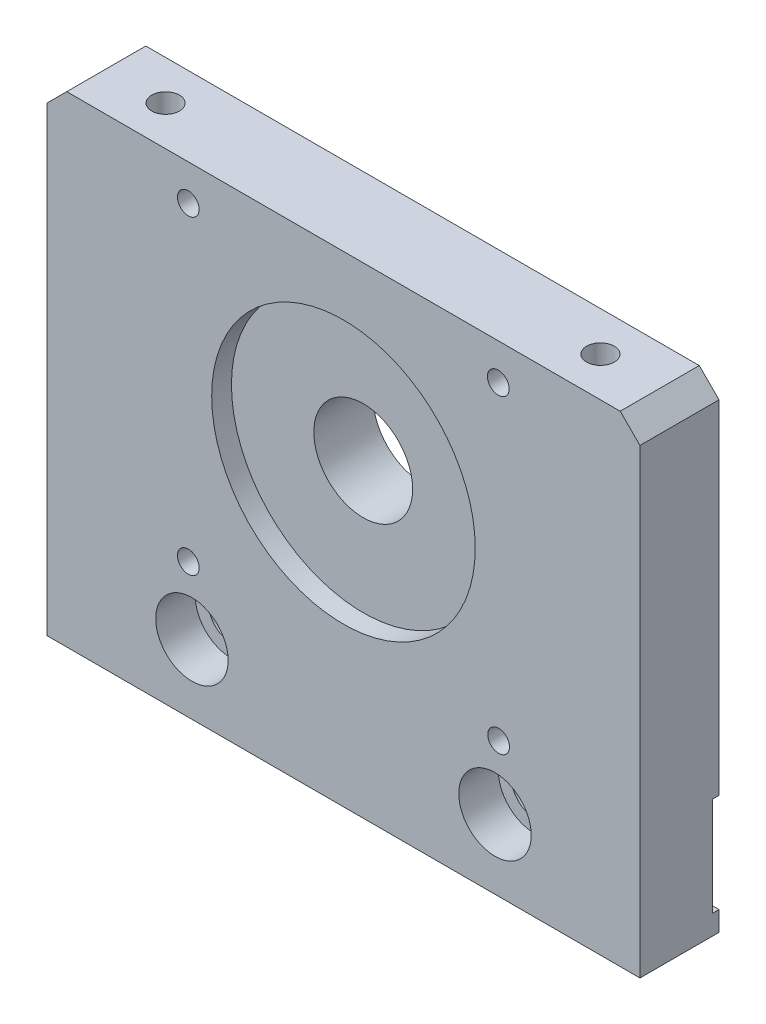
ISO-10303-21;
HEADER;
FILE_DESCRIPTION(('STEP AP214'),'2;1');
FILE_NAME('part.step','',(''),(''),'','','');
FILE_SCHEMA(('AUTOMOTIVE_DESIGN { 1 0 10303 214 1 1 1 1 }'));
ENDSEC;
DATA;
#1=APPLICATION_CONTEXT('core data for automotive mechanical design processes');
#2=APPLICATION_PROTOCOL_DEFINITION('international standard','automotive_design',2000,#1);
#3=PRODUCT_CONTEXT('',#1,'mechanical');
#4=PRODUCT('Part','Part','',(#3));
#5=PRODUCT_RELATED_PRODUCT_CATEGORY('part','',(#4));
#6=PRODUCT_DEFINITION_FORMATION('','',#4);
#7=PRODUCT_DEFINITION_CONTEXT('part definition',#1,'design');
#8=PRODUCT_DEFINITION('design','',#6,#7);
#9=PRODUCT_DEFINITION_SHAPE('','',#8);
#10=(LENGTH_UNIT() NAMED_UNIT(*) SI_UNIT(.MILLI.,.METRE.));
#11=(NAMED_UNIT(*) PLANE_ANGLE_UNIT() SI_UNIT($,.RADIAN.));
#12=(NAMED_UNIT(*) SI_UNIT($,.STERADIAN.) SOLID_ANGLE_UNIT());
#13=UNCERTAINTY_MEASURE_WITH_UNIT(LENGTH_MEASURE(1.E-05),#10,'distance_accuracy_value','');
#14=(GEOMETRIC_REPRESENTATION_CONTEXT(3) GLOBAL_UNCERTAINTY_ASSIGNED_CONTEXT((#13)) GLOBAL_UNIT_ASSIGNED_CONTEXT((#10,
#11,#12)) REPRESENTATION_CONTEXT('',''));
#15=CARTESIAN_POINT('',(0.,0.,0.));
#16=DIRECTION('',(0.,0.,1.));
#17=DIRECTION('',(1.,0.,0.));
#18=AXIS2_PLACEMENT_3D('',#15,#16,#17);
#19=CARTESIAN_POINT('',(0.,73.,0.));
#20=DIRECTION('',(0.,0.,-1.));
#21=DIRECTION('',(-1.,0.,0.));
#22=AXIS2_PLACEMENT_3D('',#19,#20,#21);
#23=PLANE('',#22);
#24=DIRECTION('',(1.,0.,0.));
#25=VECTOR('',#24,1.);
#26=CARTESIAN_POINT('',(0.,3.,0.));
#27=LINE('',#26,#25);
#28=CARTESIAN_POINT('',(0.,3.,0.));
#29=VERTEX_POINT('',#28);
#30=CARTESIAN_POINT('',(90.,3.,0.));
#31=VERTEX_POINT('',#30);
#32=EDGE_CURVE('E219',#29,#31,#27,.T.);
#33=ORIENTED_EDGE('',*,*,#32,.T.);
#34=DIRECTION('',(0.,1.,0.));
#35=VECTOR('',#34,1.);
#36=CARTESIAN_POINT('',(90.,0.,0.));
#37=LINE('',#36,#35);
#38=CARTESIAN_POINT('',(90.,0.,0.));
#39=VERTEX_POINT('',#38);
#40=EDGE_CURVE('E257',#39,#31,#37,.T.);
#41=ORIENTED_EDGE('',*,*,#40,.F.);
#42=DIRECTION('',(1.,0.,0.));
#43=VECTOR('',#42,1.);
#44=CARTESIAN_POINT('',(0.,0.,0.));
#45=LINE('',#44,#43);
#46=CARTESIAN_POINT('',(0.,0.,0.));
#47=VERTEX_POINT('',#46);
#48=EDGE_CURVE('E254',#47,#39,#45,.T.);
#49=ORIENTED_EDGE('',*,*,#48,.F.);
#50=DIRECTION('',(0.,-1.,0.));
#51=VECTOR('',#50,1.);
#52=CARTESIAN_POINT('',(0.,0.,0.));
#53=LINE('',#52,#51);
#54=EDGE_CURVE('E237',#29,#47,#53,.T.);
#55=ORIENTED_EDGE('',*,*,#54,.F.);
#56=EDGE_LOOP('',(#33,#41,#49,#55));
#57=FACE_BOUND('',#56,.T.);
#58=ADVANCED_FACE('F36',(#57),#23,.T.);
#59=CARTESIAN_POINT('',(0.,0.,12.));
#60=DIRECTION('',(1.,0.,0.));
#61=DIRECTION('',(0.,0.,-1.));
#62=AXIS2_PLACEMENT_3D('',#59,#60,#61);
#63=PLANE('',#62);
#64=CARTESIAN_POINT('',(0.,43.,5.99999999999984));
#65=DIRECTION('',(-1.,0.,0.));
#66=DIRECTION('',(0.,0.,1.));
#67=AXIS2_PLACEMENT_3D('',#64,#65,#66);
#68=CIRCLE('',#67,2.1);
#69=CARTESIAN_POINT('',(0.,43.,8.09999999999984));
#70=VERTEX_POINT('',#69);
#71=EDGE_CURVE('E144',#70,#70,#68,.T.);
#72=ORIENTED_EDGE('',*,*,#71,.F.);
#73=EDGE_LOOP('',(#72));
#74=FACE_BOUND('',#73,.T.);
#75=DIRECTION('',(0.,-1.,0.));
#76=VECTOR('',#75,1.);
#77=CARTESIAN_POINT('',(0.,3.,1.));
#78=LINE('',#77,#76);
#79=CARTESIAN_POINT('',(0.,18.,1.));
#80=VERTEX_POINT('',#79);
#81=CARTESIAN_POINT('',(0.,3.,1.));
#82=VERTEX_POINT('',#81);
#83=EDGE_CURVE('E204',#80,#82,#78,.T.);
#84=ORIENTED_EDGE('',*,*,#83,.T.);
#85=DIRECTION('',(0.,0.,-1.));
#86=VECTOR('',#85,1.);
#87=CARTESIAN_POINT('',(0.,3.,0.));
#88=LINE('',#87,#86);
#89=EDGE_CURVE('E208',#82,#29,#88,.T.);
#90=ORIENTED_EDGE('',*,*,#89,.T.);
#91=ORIENTED_EDGE('',*,*,#54,.T.);
#92=DIRECTION('',(0.,0.,-1.));
#93=VECTOR('',#92,1.);
#94=CARTESIAN_POINT('',(0.,0.,12.));
#95=LINE('',#94,#93);
#96=CARTESIAN_POINT('',(0.,0.,12.));
#97=VERTEX_POINT('',#96);
#98=EDGE_CURVE('E264',#97,#47,#95,.T.);
#99=ORIENTED_EDGE('',*,*,#98,.F.);
#100=DIRECTION('',(0.,-1.,0.));
#101=VECTOR('',#100,1.);
#102=CARTESIAN_POINT('',(0.,0.,12.));
#103=LINE('',#102,#101);
#104=CARTESIAN_POINT('',(0.,70.,12.));
#105=VERTEX_POINT('',#104);
#106=EDGE_CURVE('E240',#105,#97,#103,.T.);
#107=ORIENTED_EDGE('',*,*,#106,.F.);
#108=DIRECTION('',(0.,0.,-1.));
#109=VECTOR('',#108,1.);
#110=CARTESIAN_POINT('',(0.,70.,12.));
#111=LINE('',#110,#109);
#112=CARTESIAN_POINT('',(0.,70.,0.));
#113=VERTEX_POINT('',#112);
#114=EDGE_CURVE('E267',#105,#113,#111,.T.);
#115=ORIENTED_EDGE('',*,*,#114,.T.);
#116=CARTESIAN_POINT('',(0.,18.,0.));
#117=VERTEX_POINT('',#116);
#118=EDGE_CURVE('E251',#113,#117,#53,.T.);
#119=ORIENTED_EDGE('',*,*,#118,.T.);
#120=DIRECTION('',(0.,0.,1.));
#121=VECTOR('',#120,1.);
#122=CARTESIAN_POINT('',(0.,18.,0.));
#123=LINE('',#122,#121);
#124=EDGE_CURVE('E53',#117,#80,#123,.T.);
#125=ORIENTED_EDGE('',*,*,#124,.T.);
#126=EDGE_LOOP('',(#84,#90,#91,#99,#107,#115,#119,#125));
#127=FACE_BOUND('',#126,.T.);
#128=ADVANCED_FACE('F304',(#74,#127),#63,.F.);
#129=CARTESIAN_POINT('',(0.,0.,12.));
#130=DIRECTION('',(0.,1.,0.));
#131=DIRECTION('',(0.,0.,1.));
#132=AXIS2_PLACEMENT_3D('',#129,#130,#131);
#133=PLANE('',#132);
#134=ORIENTED_EDGE('',*,*,#48,.T.);
#135=DIRECTION('',(0.,0.,-1.));
#136=VECTOR('',#135,1.);
#137=CARTESIAN_POINT('',(90.,0.,12.));
#138=LINE('',#137,#136);
#139=CARTESIAN_POINT('',(90.,0.,12.));
#140=VERTEX_POINT('',#139);
#141=EDGE_CURVE('E250',#140,#39,#138,.T.);
#142=ORIENTED_EDGE('',*,*,#141,.F.);
#143=DIRECTION('',(1.,0.,0.));
#144=VECTOR('',#143,1.);
#145=CARTESIAN_POINT('',(0.,0.,12.));
#146=LINE('',#145,#144);
#147=EDGE_CURVE('E242',#97,#140,#146,.T.);
#148=ORIENTED_EDGE('',*,*,#147,.F.);
#149=ORIENTED_EDGE('',*,*,#98,.T.);
#150=EDGE_LOOP('',(#134,#142,#148,#149));
#151=FACE_BOUND('',#150,.T.);
#152=ADVANCED_FACE('F312',(#151),#133,.F.);
#153=CARTESIAN_POINT('',(90.,0.,12.));
#154=DIRECTION('',(-1.,0.,0.));
#155=DIRECTION('',(0.,0.,1.));
#156=AXIS2_PLACEMENT_3D('',#153,#154,#155);
#157=PLANE('',#156);
#158=ORIENTED_EDGE('',*,*,#40,.T.);
#159=DIRECTION('',(0.,0.,-1.));
#160=VECTOR('',#159,1.);
#161=CARTESIAN_POINT('',(90.,3.,0.));
#162=LINE('',#161,#160);
#163=CARTESIAN_POINT('',(90.,3.,1.));
#164=VERTEX_POINT('',#163);
#165=EDGE_CURVE('E205',#164,#31,#162,.T.);
#166=ORIENTED_EDGE('',*,*,#165,.F.);
#167=DIRECTION('',(0.,-1.,0.));
#168=VECTOR('',#167,1.);
#169=CARTESIAN_POINT('',(90.,3.,1.));
#170=LINE('',#169,#168);
#171=CARTESIAN_POINT('',(90.,18.,1.));
#172=VERTEX_POINT('',#171);
#173=EDGE_CURVE('E215',#172,#164,#170,.T.);
#174=ORIENTED_EDGE('',*,*,#173,.F.);
#175=DIRECTION('',(0.,0.,1.));
#176=VECTOR('',#175,1.);
#177=CARTESIAN_POINT('',(90.,18.,0.));
#178=LINE('',#177,#176);
#179=CARTESIAN_POINT('',(90.,18.,0.));
#180=VERTEX_POINT('',#179);
#181=EDGE_CURVE('E212',#180,#172,#178,.T.);
#182=ORIENTED_EDGE('',*,*,#181,.F.);
#183=CARTESIAN_POINT('',(90.,70.,0.));
#184=VERTEX_POINT('',#183);
#185=EDGE_CURVE('E256',#180,#184,#37,.T.);
#186=ORIENTED_EDGE('',*,*,#185,.T.);
#187=DIRECTION('',(0.,0.,1.));
#188=VECTOR('',#187,1.);
#189=CARTESIAN_POINT('',(90.,70.,12.));
#190=LINE('',#189,#188);
#191=CARTESIAN_POINT('',(90.,70.,12.));
#192=VERTEX_POINT('',#191);
#193=EDGE_CURVE('E11',#184,#192,#190,.T.);
#194=ORIENTED_EDGE('',*,*,#193,.T.);
#195=DIRECTION('',(0.,1.,0.));
#196=VECTOR('',#195,1.);
#197=CARTESIAN_POINT('',(90.,0.,12.));
#198=LINE('',#197,#196);
#199=EDGE_CURVE('E245',#140,#192,#198,.T.);
#200=ORIENTED_EDGE('',*,*,#199,.F.);
#201=ORIENTED_EDGE('',*,*,#141,.T.);
#202=EDGE_LOOP('',(#158,#166,#174,#182,#186,#194,#200,#201));
#203=FACE_BOUND('',#202,.T.);
#204=ADVANCED_FACE('F365',(#203),#157,.F.);
#205=CARTESIAN_POINT('',(0.,73.,12.));
#206=DIRECTION('',(0.,-1.,0.));
#207=DIRECTION('',(0.,0.,-1.));
#208=AXIS2_PLACEMENT_3D('',#205,#206,#207);
#209=PLANE('',#208);
#210=CARTESIAN_POINT('',(11.9999999999999,73.,6.00000000000001));
#211=DIRECTION('',(0.,1.,0.));
#212=DIRECTION('',(0.,0.,1.));
#213=AXIS2_PLACEMENT_3D('',#210,#211,#212);
#214=CIRCLE('',#213,2.09999999999999);
#215=CARTESIAN_POINT('',(11.9999999999999,73.,8.1));
#216=VERTEX_POINT('',#215);
#217=EDGE_CURVE('E172',#216,#216,#214,.T.);
#218=ORIENTED_EDGE('',*,*,#217,.F.);
#219=EDGE_LOOP('',(#218));
#220=FACE_BOUND('',#219,.T.);
#221=CARTESIAN_POINT('',(78.0000000000001,73.,6.00000000000001));
#222=DIRECTION('',(0.,1.,0.));
#223=DIRECTION('',(0.,0.,1.));
#224=AXIS2_PLACEMENT_3D('',#221,#222,#223);
#225=CIRCLE('',#224,2.09999999999999);
#226=CARTESIAN_POINT('',(78.0000000000001,73.,8.1));
#227=VERTEX_POINT('',#226);
#228=EDGE_CURVE('E178',#227,#227,#225,.T.);
#229=ORIENTED_EDGE('',*,*,#228,.F.);
#230=EDGE_LOOP('',(#229));
#231=FACE_BOUND('',#230,.T.);
#232=DIRECTION('',(-1.,0.,0.));
#233=VECTOR('',#232,1.);
#234=CARTESIAN_POINT('',(0.,73.,0.));
#235=LINE('',#234,#233);
#236=CARTESIAN_POINT('',(87.,73.,0.));
#237=VERTEX_POINT('',#236);
#238=CARTESIAN_POINT('',(3.00000000000003,73.,0.));
#239=VERTEX_POINT('',#238);
#240=EDGE_CURVE('E243',#237,#239,#235,.T.);
#241=ORIENTED_EDGE('',*,*,#240,.T.);
#242=DIRECTION('',(0.,0.,1.));
#243=VECTOR('',#242,1.);
#244=CARTESIAN_POINT('',(3.00000000000003,73.,12.));
#245=LINE('',#244,#243);
#246=CARTESIAN_POINT('',(3.00000000000003,73.,12.));
#247=VERTEX_POINT('',#246);
#248=EDGE_CURVE('E278',#239,#247,#245,.T.);
#249=ORIENTED_EDGE('',*,*,#248,.T.);
#250=DIRECTION('',(-1.,0.,0.));
#251=VECTOR('',#250,1.);
#252=CARTESIAN_POINT('',(0.,73.,12.));
#253=LINE('',#252,#251);
#254=CARTESIAN_POINT('',(87.,73.,12.));
#255=VERTEX_POINT('',#254);
#256=EDGE_CURVE('E247',#255,#247,#253,.T.);
#257=ORIENTED_EDGE('',*,*,#256,.F.);
#258=DIRECTION('',(0.,0.,-1.));
#259=VECTOR('',#258,1.);
#260=CARTESIAN_POINT('',(87.,73.,12.));
#261=LINE('',#260,#259);
#262=EDGE_CURVE('E275',#255,#237,#261,.T.);
#263=ORIENTED_EDGE('',*,*,#262,.T.);
#264=EDGE_LOOP('',(#241,#249,#257,#263));
#265=FACE_BOUND('',#264,.T.);
#266=ADVANCED_FACE('F329',(#220,#231,#265),#209,.F.);
#267=CARTESIAN_POINT('',(0.,73.,12.));
#268=DIRECTION('',(0.,0.,-1.));
#269=DIRECTION('',(-1.,0.,0.));
#270=AXIS2_PLACEMENT_3D('',#267,#268,#269);
#271=PLANE('',#270);
#272=CARTESIAN_POINT('',(68.4999999999999,67.5000000000001,12.));
#273=DIRECTION('',(0.,0.,1.));
#274=DIRECTION('',(1.,0.,0.));
#275=AXIS2_PLACEMENT_3D('',#272,#273,#274);
#276=CIRCLE('',#275,1.65);
#277=CARTESIAN_POINT('',(70.1499999999999,67.5000000000001,12.));
#278=VERTEX_POINT('',#277);
#279=EDGE_CURVE('E143',#278,#278,#276,.T.);
#280=ORIENTED_EDGE('',*,*,#279,.F.);
#281=EDGE_LOOP('',(#280));
#282=FACE_BOUND('',#281,.T.);
#283=CARTESIAN_POINT('',(21.4499999999999,67.5500000000001,12.));
#284=DIRECTION('',(0.,0.,1.));
#285=DIRECTION('',(1.,0.,0.));
#286=AXIS2_PLACEMENT_3D('',#283,#284,#285);
#287=CIRCLE('',#286,1.65);
#288=CARTESIAN_POINT('',(23.0999999999999,67.5500000000001,12.));
#289=VERTEX_POINT('',#288);
#290=EDGE_CURVE('E154',#289,#289,#287,.T.);
#291=ORIENTED_EDGE('',*,*,#290,.F.);
#292=EDGE_LOOP('',(#291));
#293=FACE_BOUND('',#292,.T.);
#294=CARTESIAN_POINT('',(21.4499999999999,20.4500000000001,12.));
#295=DIRECTION('',(0.,0.,1.));
#296=DIRECTION('',(1.,0.,0.));
#297=AXIS2_PLACEMENT_3D('',#294,#295,#296);
#298=CIRCLE('',#297,1.65);
#299=CARTESIAN_POINT('',(23.0999999999999,20.4500000000001,12.));
#300=VERTEX_POINT('',#299);
#301=EDGE_CURVE('E160',#300,#300,#298,.T.);
#302=ORIENTED_EDGE('',*,*,#301,.F.);
#303=EDGE_LOOP('',(#302));
#304=FACE_BOUND('',#303,.T.);
#305=CARTESIAN_POINT('',(68.5499999999999,20.4500000000001,12.));
#306=DIRECTION('',(0.,0.,1.));
#307=DIRECTION('',(1.,0.,0.));
#308=AXIS2_PLACEMENT_3D('',#305,#306,#307);
#309=CIRCLE('',#308,1.65);
#310=CARTESIAN_POINT('',(70.1999999999999,20.4500000000001,12.));
#311=VERTEX_POINT('',#310);
#312=EDGE_CURVE('E166',#311,#311,#309,.T.);
#313=ORIENTED_EDGE('',*,*,#312,.F.);
#314=EDGE_LOOP('',(#313));
#315=FACE_BOUND('',#314,.T.);
#316=CARTESIAN_POINT('',(22.,10.5,12.));
#317=DIRECTION('',(0.,0.,1.));
#318=DIRECTION('',(1.,0.,0.));
#319=AXIS2_PLACEMENT_3D('',#316,#317,#318);
#320=CIRCLE('',#319,5.49999999999999);
#321=CARTESIAN_POINT('',(27.5,10.5,12.));
#322=VERTEX_POINT('',#321);
#323=EDGE_CURVE('E184',#322,#322,#320,.T.);
#324=ORIENTED_EDGE('',*,*,#323,.F.);
#325=EDGE_LOOP('',(#324));
#326=FACE_BOUND('',#325,.T.);
#327=CARTESIAN_POINT('',(68.,10.5,12.));
#328=DIRECTION('',(0.,0.,1.));
#329=DIRECTION('',(1.,0.,0.));
#330=AXIS2_PLACEMENT_3D('',#327,#328,#329);
#331=CIRCLE('',#330,5.49999999999999);
#332=CARTESIAN_POINT('',(73.5,10.5,12.));
#333=VERTEX_POINT('',#332);
#334=EDGE_CURVE('E193',#333,#333,#331,.T.);
#335=ORIENTED_EDGE('',*,*,#334,.F.);
#336=EDGE_LOOP('',(#335));
#337=FACE_BOUND('',#336,.T.);
#338=CARTESIAN_POINT('',(45.,44.,12.));
#339=DIRECTION('',(0.,0.,1.));
#340=DIRECTION('',(1.,0.,0.));
#341=AXIS2_PLACEMENT_3D('',#338,#339,#340);
#342=CIRCLE('',#341,20.);
#343=CARTESIAN_POINT('',(65.,44.,12.));
#344=VERTEX_POINT('',#343);
#345=EDGE_CURVE('E231',#344,#344,#342,.T.);
#346=ORIENTED_EDGE('',*,*,#345,.F.);
#347=EDGE_LOOP('',(#346));
#348=FACE_BOUND('',#347,.T.);
#349=ORIENTED_EDGE('',*,*,#256,.T.);
#350=DIRECTION('',(0.707106781186549,0.707106781186546,0.));
#351=VECTOR('',#350,1.);
#352=CARTESIAN_POINT('',(0.,70.,12.));
#353=LINE('',#352,#351);
#354=EDGE_CURVE('E45',#247,#105,#353,.F.);
#355=ORIENTED_EDGE('',*,*,#354,.T.);
#356=ORIENTED_EDGE('',*,*,#106,.T.);
#357=ORIENTED_EDGE('',*,*,#147,.T.);
#358=ORIENTED_EDGE('',*,*,#199,.T.);
#359=DIRECTION('',(0.707106781186544,-0.707106781186551,0.));
#360=VECTOR('',#359,1.);
#361=CARTESIAN_POINT('',(87.,73.,12.));
#362=LINE('',#361,#360);
#363=EDGE_CURVE('E280',#192,#255,#362,.F.);
#364=ORIENTED_EDGE('',*,*,#363,.T.);
#365=EDGE_LOOP('',(#349,#355,#356,#357,#358,#364));
#366=FACE_BOUND('',#365,.T.);
#367=ADVANCED_FACE('F319',(#282,#293,#304,#315,#326,#337,#348,#366),#271,.F.);
#368=DIRECTION('',(1.,0.,0.));
#369=VECTOR('',#368,1.);
#370=CARTESIAN_POINT('',(0.,18.,0.));
#371=LINE('',#370,#369);
#372=EDGE_CURVE('E211',#117,#180,#371,.T.);
#373=ORIENTED_EDGE('',*,*,#372,.F.);
#374=ORIENTED_EDGE('',*,*,#118,.F.);
#375=DIRECTION('',(-0.707106781186549,-0.707106781186546,0.));
#376=VECTOR('',#375,1.);
#377=CARTESIAN_POINT('',(1.50000000000001,71.5,0.));
#378=LINE('',#377,#376);
#379=EDGE_CURVE('E273',#113,#239,#378,.F.);
#380=ORIENTED_EDGE('',*,*,#379,.T.);
#381=ORIENTED_EDGE('',*,*,#240,.F.);
#382=DIRECTION('',(-0.707106781186544,0.707106781186551,0.));
#383=VECTOR('',#382,1.);
#384=CARTESIAN_POINT('',(43.5000000000004,116.5,0.));
#385=LINE('',#384,#383);
#386=EDGE_CURVE('E270',#237,#184,#385,.F.);
#387=ORIENTED_EDGE('',*,*,#386,.T.);
#388=ORIENTED_EDGE('',*,*,#185,.F.);
#389=EDGE_LOOP('',(#373,#374,#380,#381,#387,#388));
#390=FACE_BOUND('',#389,.T.);
#391=CARTESIAN_POINT('',(45.,44.,0.));
#392=DIRECTION('',(0.,0.,1.));
#393=DIRECTION('',(1.,0.,0.));
#394=AXIS2_PLACEMENT_3D('',#391,#392,#393);
#395=CIRCLE('',#394,7.5);
#396=CARTESIAN_POINT('',(52.5,44.,0.));
#397=VERTEX_POINT('',#396);
#398=EDGE_CURVE('E228',#397,#397,#395,.T.);
#399=ORIENTED_EDGE('',*,*,#398,.T.);
#400=EDGE_LOOP('',(#399));
#401=FACE_BOUND('',#400,.T.);
#402=ADVANCED_FACE('F307',(#390,#401),#23,.T.);
#403=CARTESIAN_POINT('',(45.,44.,9.));
#404=DIRECTION('',(0.,0.,1.));
#405=DIRECTION('',(1.,0.,0.));
#406=AXIS2_PLACEMENT_3D('',#403,#404,#405);
#407=CYLINDRICAL_SURFACE('',#406,20.);
#408=CARTESIAN_POINT('',(45.,44.,9.));
#409=DIRECTION('',(0.,0.,1.));
#410=DIRECTION('',(1.,0.,0.));
#411=AXIS2_PLACEMENT_3D('',#408,#409,#410);
#412=CIRCLE('',#411,20.);
#413=CARTESIAN_POINT('',(65.,44.,9.));
#414=VERTEX_POINT('',#413);
#415=EDGE_CURVE('E234',#414,#414,#412,.T.);
#416=ORIENTED_EDGE('',*,*,#415,.F.);
#417=EDGE_LOOP('',(#416));
#418=FACE_BOUND('',#417,.T.);
#419=ORIENTED_EDGE('',*,*,#345,.T.);
#420=EDGE_LOOP('',(#419));
#421=FACE_BOUND('',#420,.T.);
#422=ADVANCED_FACE('F318',(#418,#421),#407,.F.);
#423=CARTESIAN_POINT('',(45.,44.,9.));
#424=DIRECTION('',(0.,0.,1.));
#425=DIRECTION('',(1.,0.,0.));
#426=AXIS2_PLACEMENT_3D('',#423,#424,#425);
#427=PLANE('',#426);
#428=CARTESIAN_POINT('',(45.,44.,9.));
#429=DIRECTION('',(0.,0.,1.));
#430=DIRECTION('',(1.,0.,0.));
#431=AXIS2_PLACEMENT_3D('',#428,#429,#430);
#432=CIRCLE('',#431,7.5);
#433=CARTESIAN_POINT('',(52.5,44.,9.));
#434=VERTEX_POINT('',#433);
#435=EDGE_CURVE('E222',#434,#434,#432,.T.);
#436=ORIENTED_EDGE('',*,*,#435,.F.);
#437=EDGE_LOOP('',(#436));
#438=FACE_BOUND('',#437,.T.);
#439=ORIENTED_EDGE('',*,*,#415,.T.);
#440=EDGE_LOOP('',(#439));
#441=FACE_BOUND('',#440,.T.);
#442=ADVANCED_FACE('F325',(#438,#441),#427,.T.);
#443=CARTESIAN_POINT('',(45.,44.,0.));
#444=DIRECTION('',(0.,0.,1.));
#445=DIRECTION('',(1.,0.,0.));
#446=AXIS2_PLACEMENT_3D('',#443,#444,#445);
#447=CYLINDRICAL_SURFACE('',#446,7.5);
#448=ORIENTED_EDGE('',*,*,#398,.F.);
#449=EDGE_LOOP('',(#448));
#450=FACE_BOUND('',#449,.T.);
#451=ORIENTED_EDGE('',*,*,#435,.T.);
#452=EDGE_LOOP('',(#451));
#453=FACE_BOUND('',#452,.T.);
#454=ADVANCED_FACE('F336',(#450,#453),#447,.F.);
#455=CARTESIAN_POINT('',(0.,70.,12.));
#456=DIRECTION('',(0.707106781186546,-0.707106781186549,0.));
#457=DIRECTION('',(0.707106781186549,0.707106781186546,0.));
#458=AXIS2_PLACEMENT_3D('',#455,#456,#457);
#459=PLANE('',#458);
#460=ORIENTED_EDGE('',*,*,#354,.F.);
#461=ORIENTED_EDGE('',*,*,#248,.F.);
#462=ORIENTED_EDGE('',*,*,#379,.F.);
#463=ORIENTED_EDGE('',*,*,#114,.F.);
#464=EDGE_LOOP('',(#460,#461,#462,#463));
#465=FACE_BOUND('',#464,.T.);
#466=ADVANCED_FACE('F339',(#465),#459,.F.);
#467=CARTESIAN_POINT('',(87.,73.,12.));
#468=DIRECTION('',(-0.707106781186551,-0.707106781186544,0.));
#469=DIRECTION('',(0.707106781186544,-0.707106781186551,0.));
#470=AXIS2_PLACEMENT_3D('',#467,#468,#469);
#471=PLANE('',#470);
#472=ORIENTED_EDGE('',*,*,#363,.F.);
#473=ORIENTED_EDGE('',*,*,#193,.F.);
#474=ORIENTED_EDGE('',*,*,#386,.F.);
#475=ORIENTED_EDGE('',*,*,#262,.F.);
#476=EDGE_LOOP('',(#472,#473,#474,#475));
#477=FACE_BOUND('',#476,.T.);
#478=ADVANCED_FACE('F38',(#477),#471,.F.);
#479=CARTESIAN_POINT('',(0.,3.,0.));
#480=DIRECTION('',(0.,-1.,0.));
#481=DIRECTION('',(0.,0.,-1.));
#482=AXIS2_PLACEMENT_3D('',#479,#480,#481);
#483=PLANE('',#482);
#484=ORIENTED_EDGE('',*,*,#165,.T.);
#485=ORIENTED_EDGE('',*,*,#32,.F.);
#486=ORIENTED_EDGE('',*,*,#89,.F.);
#487=DIRECTION('',(1.,0.,0.));
#488=VECTOR('',#487,1.);
#489=CARTESIAN_POINT('',(0.,3.,1.));
#490=LINE('',#489,#488);
#491=EDGE_CURVE('E223',#82,#164,#490,.T.);
#492=ORIENTED_EDGE('',*,*,#491,.T.);
#493=EDGE_LOOP('',(#484,#485,#486,#492));
#494=FACE_BOUND('',#493,.T.);
#495=ADVANCED_FACE('F377',(#494),#483,.F.);
#496=CARTESIAN_POINT('',(0.,3.,1.));
#497=DIRECTION('',(0.,0.,1.));
#498=DIRECTION('',(1.,0.,0.));
#499=AXIS2_PLACEMENT_3D('',#496,#497,#498);
#500=PLANE('',#499);
#501=CARTESIAN_POINT('',(22.,10.5,1.));
#502=DIRECTION('',(0.,0.,1.));
#503=DIRECTION('',(1.,0.,0.));
#504=AXIS2_PLACEMENT_3D('',#501,#502,#503);
#505=CIRCLE('',#504,3.5);
#506=CARTESIAN_POINT('',(25.5,10.5,1.));
#507=VERTEX_POINT('',#506);
#508=EDGE_CURVE('E40',#507,#507,#505,.T.);
#509=ORIENTED_EDGE('',*,*,#508,.T.);
#510=EDGE_LOOP('',(#509));
#511=FACE_BOUND('',#510,.T.);
#512=CARTESIAN_POINT('',(68.,10.5,1.));
#513=DIRECTION('',(0.,0.,1.));
#514=DIRECTION('',(1.,0.,0.));
#515=AXIS2_PLACEMENT_3D('',#512,#513,#514);
#516=CIRCLE('',#515,3.5);
#517=CARTESIAN_POINT('',(71.5,10.5,1.));
#518=VERTEX_POINT('',#517);
#519=EDGE_CURVE('E202',#518,#518,#516,.T.);
#520=ORIENTED_EDGE('',*,*,#519,.T.);
#521=EDGE_LOOP('',(#520));
#522=FACE_BOUND('',#521,.T.);
#523=ORIENTED_EDGE('',*,*,#173,.T.);
#524=ORIENTED_EDGE('',*,*,#491,.F.);
#525=ORIENTED_EDGE('',*,*,#83,.F.);
#526=DIRECTION('',(1.,0.,0.));
#527=VECTOR('',#526,1.);
#528=CARTESIAN_POINT('',(0.,18.,1.));
#529=LINE('',#528,#527);
#530=EDGE_CURVE('E225',#80,#172,#529,.T.);
#531=ORIENTED_EDGE('',*,*,#530,.T.);
#532=EDGE_LOOP('',(#523,#524,#525,#531));
#533=FACE_BOUND('',#532,.T.);
#534=ADVANCED_FACE('F285',(#511,#522,#533),#500,.F.);
#535=CARTESIAN_POINT('',(0.,18.,0.));
#536=DIRECTION('',(0.,1.,0.));
#537=DIRECTION('',(0.,0.,1.));
#538=AXIS2_PLACEMENT_3D('',#535,#536,#537);
#539=PLANE('',#538);
#540=ORIENTED_EDGE('',*,*,#181,.T.);
#541=ORIENTED_EDGE('',*,*,#530,.F.);
#542=ORIENTED_EDGE('',*,*,#124,.F.);
#543=ORIENTED_EDGE('',*,*,#372,.T.);
#544=EDGE_LOOP('',(#540,#541,#542,#543));
#545=FACE_BOUND('',#544,.T.);
#546=ADVANCED_FACE('F291',(#545),#539,.F.);
#547=CARTESIAN_POINT('',(68.,10.5,12.));
#548=DIRECTION('',(0.,0.,1.));
#549=DIRECTION('',(1.,0.,0.));
#550=AXIS2_PLACEMENT_3D('',#547,#548,#549);
#551=CYLINDRICAL_SURFACE('',#550,3.5);
#552=CARTESIAN_POINT('',(68.,10.5,6.));
#553=DIRECTION('',(0.,0.,1.));
#554=DIRECTION('',(1.,0.,0.));
#555=AXIS2_PLACEMENT_3D('',#552,#553,#554);
#556=CIRCLE('',#555,3.5);
#557=CARTESIAN_POINT('',(71.5,10.5,6.));
#558=VERTEX_POINT('',#557);
#559=EDGE_CURVE('E199',#558,#558,#556,.T.);
#560=ORIENTED_EDGE('',*,*,#559,.T.);
#561=EDGE_LOOP('',(#560));
#562=FACE_BOUND('',#561,.T.);
#563=ORIENTED_EDGE('',*,*,#519,.F.);
#564=EDGE_LOOP('',(#563));
#565=FACE_BOUND('',#564,.T.);
#566=ADVANCED_FACE('F288',(#562,#565),#551,.F.);
#567=CARTESIAN_POINT('',(71.5,10.5,6.));
#568=DIRECTION('',(0.,0.,-1.));
#569=DIRECTION('',(-1.,0.,0.));
#570=AXIS2_PLACEMENT_3D('',#567,#568,#569);
#571=PLANE('',#570);
#572=ORIENTED_EDGE('',*,*,#559,.F.);
#573=EDGE_LOOP('',(#572));
#574=FACE_BOUND('',#573,.T.);
#575=CARTESIAN_POINT('',(68.,10.5,6.));
#576=DIRECTION('',(0.,0.,1.));
#577=DIRECTION('',(1.,0.,0.));
#578=AXIS2_PLACEMENT_3D('',#575,#576,#577);
#579=CIRCLE('',#578,5.49999999999999);
#580=CARTESIAN_POINT('',(73.5,10.5,6.));
#581=VERTEX_POINT('',#580);
#582=EDGE_CURVE('E196',#581,#581,#579,.T.);
#583=ORIENTED_EDGE('',*,*,#582,.T.);
#584=EDGE_LOOP('',(#583));
#585=FACE_BOUND('',#584,.T.);
#586=ADVANCED_FACE('F290',(#574,#585),#571,.F.);
#587=CARTESIAN_POINT('',(68.,10.5,12.));
#588=DIRECTION('',(0.,0.,1.));
#589=DIRECTION('',(1.,0.,0.));
#590=AXIS2_PLACEMENT_3D('',#587,#588,#589);
#591=CYLINDRICAL_SURFACE('',#590,5.49999999999999);
#592=ORIENTED_EDGE('',*,*,#582,.F.);
#593=EDGE_LOOP('',(#592));
#594=FACE_BOUND('',#593,.T.);
#595=ORIENTED_EDGE('',*,*,#334,.T.);
#596=EDGE_LOOP('',(#595));
#597=FACE_BOUND('',#596,.T.);
#598=ADVANCED_FACE('F298',(#594,#597),#591,.F.);
#599=CARTESIAN_POINT('',(22.,10.5,12.));
#600=DIRECTION('',(0.,0.,1.));
#601=DIRECTION('',(1.,0.,0.));
#602=AXIS2_PLACEMENT_3D('',#599,#600,#601);
#603=CYLINDRICAL_SURFACE('',#602,3.5);
#604=CARTESIAN_POINT('',(22.,10.5,6.));
#605=DIRECTION('',(0.,0.,1.));
#606=DIRECTION('',(1.,0.,0.));
#607=AXIS2_PLACEMENT_3D('',#604,#605,#606);
#608=CIRCLE('',#607,3.5);
#609=CARTESIAN_POINT('',(25.5,10.5,6.));
#610=VERTEX_POINT('',#609);
#611=EDGE_CURVE('E190',#610,#610,#608,.T.);
#612=ORIENTED_EDGE('',*,*,#611,.T.);
#613=EDGE_LOOP('',(#612));
#614=FACE_BOUND('',#613,.T.);
#615=ORIENTED_EDGE('',*,*,#508,.F.);
#616=EDGE_LOOP('',(#615));
#617=FACE_BOUND('',#616,.T.);
#618=ADVANCED_FACE('F430',(#614,#617),#603,.F.);
#619=CARTESIAN_POINT('',(25.5,10.5,6.));
#620=DIRECTION('',(0.,0.,-1.));
#621=DIRECTION('',(-1.,0.,0.));
#622=AXIS2_PLACEMENT_3D('',#619,#620,#621);
#623=PLANE('',#622);
#624=ORIENTED_EDGE('',*,*,#611,.F.);
#625=EDGE_LOOP('',(#624));
#626=FACE_BOUND('',#625,.T.);
#627=CARTESIAN_POINT('',(22.,10.5,6.));
#628=DIRECTION('',(0.,0.,1.));
#629=DIRECTION('',(1.,0.,0.));
#630=AXIS2_PLACEMENT_3D('',#627,#628,#629);
#631=CIRCLE('',#630,5.5);
#632=CARTESIAN_POINT('',(27.5,10.5,6.));
#633=VERTEX_POINT('',#632);
#634=EDGE_CURVE('E187',#633,#633,#631,.T.);
#635=ORIENTED_EDGE('',*,*,#634,.T.);
#636=EDGE_LOOP('',(#635));
#637=FACE_BOUND('',#636,.T.);
#638=ADVANCED_FACE('F426',(#626,#637),#623,.F.);
#639=CARTESIAN_POINT('',(22.,10.5,12.));
#640=DIRECTION('',(0.,0.,1.));
#641=DIRECTION('',(1.,0.,0.));
#642=AXIS2_PLACEMENT_3D('',#639,#640,#641);
#643=CYLINDRICAL_SURFACE('',#642,5.5);
#644=ORIENTED_EDGE('',*,*,#634,.F.);
#645=EDGE_LOOP('',(#644));
#646=FACE_BOUND('',#645,.T.);
#647=ORIENTED_EDGE('',*,*,#323,.T.);
#648=EDGE_LOOP('',(#647));
#649=FACE_BOUND('',#648,.T.);
#650=ADVANCED_FACE('F418',(#646,#649),#643,.F.);
#651=CARTESIAN_POINT('',(78.0000000000001,60.6,6.00000000000001));
#652=DIRECTION('',(0.,1.,0.));
#653=DIRECTION('',(0.,0.,1.));
#654=AXIS2_PLACEMENT_3D('',#651,#652,#653);
#655=CONICAL_SURFACE('',#654,2.09999999999999,1.02974425867666);
#656=CARTESIAN_POINT('',(78.0000000000001,59.3381927000421,6.00000000000001));
#657=VERTEX_POINT('',#656);
#658=VERTEX_LOOP('',#657);
#659=FACE_BOUND('',#658,.T.);
#660=CARTESIAN_POINT('',(78.0000000000001,60.6,6.00000000000001));
#661=DIRECTION('',(0.,1.,0.));
#662=DIRECTION('',(0.,0.,1.));
#663=AXIS2_PLACEMENT_3D('',#660,#661,#662);
#664=CIRCLE('',#663,2.09999999999999);
#665=CARTESIAN_POINT('',(78.0000000000001,60.6,8.1));
#666=VERTEX_POINT('',#665);
#667=EDGE_CURVE('E181',#666,#666,#664,.T.);
#668=ORIENTED_EDGE('',*,*,#667,.T.);
#669=EDGE_LOOP('',(#668));
#670=FACE_BOUND('',#669,.T.);
#671=ADVANCED_FACE('F408',(#659,#670),#655,.F.);
#672=CARTESIAN_POINT('',(78.0000000000001,73.,6.00000000000001));
#673=DIRECTION('',(0.,1.,0.));
#674=DIRECTION('',(0.,0.,1.));
#675=AXIS2_PLACEMENT_3D('',#672,#673,#674);
#676=CYLINDRICAL_SURFACE('',#675,2.09999999999999);
#677=ORIENTED_EDGE('',*,*,#667,.F.);
#678=EDGE_LOOP('',(#677));
#679=FACE_BOUND('',#678,.T.);
#680=ORIENTED_EDGE('',*,*,#228,.T.);
#681=EDGE_LOOP('',(#680));
#682=FACE_BOUND('',#681,.T.);
#683=ADVANCED_FACE('F405',(#679,#682),#676,.F.);
#684=CARTESIAN_POINT('',(11.9999999999999,60.6,6.00000000000001));
#685=DIRECTION('',(0.,1.,0.));
#686=DIRECTION('',(0.,0.,1.));
#687=AXIS2_PLACEMENT_3D('',#684,#685,#686);
#688=CONICAL_SURFACE('',#687,2.09999999999999,1.02974425867665);
#689=CARTESIAN_POINT('',(11.9999999999999,59.3381927000421,6.00000000000001));
#690=VERTEX_POINT('',#689);
#691=VERTEX_LOOP('',#690);
#692=FACE_BOUND('',#691,.T.);
#693=CARTESIAN_POINT('',(11.9999999999999,60.6,6.00000000000001));
#694=DIRECTION('',(0.,1.,0.));
#695=DIRECTION('',(0.,0.,1.));
#696=AXIS2_PLACEMENT_3D('',#693,#694,#695);
#697=CIRCLE('',#696,2.09999999999999);
#698=CARTESIAN_POINT('',(11.9999999999999,60.6,8.1));
#699=VERTEX_POINT('',#698);
#700=EDGE_CURVE('E175',#699,#699,#697,.T.);
#701=ORIENTED_EDGE('',*,*,#700,.T.);
#702=EDGE_LOOP('',(#701));
#703=FACE_BOUND('',#702,.T.);
#704=ADVANCED_FACE('F407',(#692,#703),#688,.F.);
#705=CARTESIAN_POINT('',(11.9999999999999,73.,6.00000000000001));
#706=DIRECTION('',(0.,1.,0.));
#707=DIRECTION('',(0.,0.,1.));
#708=AXIS2_PLACEMENT_3D('',#705,#706,#707);
#709=CYLINDRICAL_SURFACE('',#708,2.09999999999999);
#710=ORIENTED_EDGE('',*,*,#700,.F.);
#711=EDGE_LOOP('',(#710));
#712=FACE_BOUND('',#711,.T.);
#713=ORIENTED_EDGE('',*,*,#217,.T.);
#714=EDGE_LOOP('',(#713));
#715=FACE_BOUND('',#714,.T.);
#716=ADVANCED_FACE('F415',(#712,#715),#709,.F.);
#717=CARTESIAN_POINT('',(68.5499999999999,20.4500000000001,1.9));
#718=DIRECTION('',(0.,0.,1.));
#719=DIRECTION('',(1.,0.,0.));
#720=AXIS2_PLACEMENT_3D('',#717,#718,#719);
#721=CONICAL_SURFACE('',#720,1.65,1.02974425867665);
#722=CARTESIAN_POINT('',(68.5499999999999,20.4500000000001,0.908579978604525));
#723=VERTEX_POINT('',#722);
#724=VERTEX_LOOP('',#723);
#725=FACE_BOUND('',#724,.T.);
#726=CARTESIAN_POINT('',(68.5499999999999,20.4500000000001,1.9));
#727=DIRECTION('',(0.,0.,1.));
#728=DIRECTION('',(1.,0.,0.));
#729=AXIS2_PLACEMENT_3D('',#726,#727,#728);
#730=CIRCLE('',#729,1.65);
#731=CARTESIAN_POINT('',(70.1999999999999,20.4500000000001,1.9));
#732=VERTEX_POINT('',#731);
#733=EDGE_CURVE('E169',#732,#732,#730,.T.);
#734=ORIENTED_EDGE('',*,*,#733,.T.);
#735=EDGE_LOOP('',(#734));
#736=FACE_BOUND('',#735,.T.);
#737=ADVANCED_FACE('F481',(#725,#736),#721,.F.);
#738=CARTESIAN_POINT('',(68.5499999999999,20.4500000000001,12.));
#739=DIRECTION('',(0.,0.,1.));
#740=DIRECTION('',(1.,0.,0.));
#741=AXIS2_PLACEMENT_3D('',#738,#739,#740);
#742=CYLINDRICAL_SURFACE('',#741,1.65);
#743=ORIENTED_EDGE('',*,*,#733,.F.);
#744=EDGE_LOOP('',(#743));
#745=FACE_BOUND('',#744,.T.);
#746=ORIENTED_EDGE('',*,*,#312,.T.);
#747=EDGE_LOOP('',(#746));
#748=FACE_BOUND('',#747,.T.);
#749=ADVANCED_FACE('F495',(#745,#748),#742,.F.);
#750=CARTESIAN_POINT('',(21.4499999999999,20.4500000000001,1.9));
#751=DIRECTION('',(0.,0.,1.));
#752=DIRECTION('',(1.,0.,0.));
#753=AXIS2_PLACEMENT_3D('',#750,#751,#752);
#754=CONICAL_SURFACE('',#753,1.65,1.02974425867665);
#755=CARTESIAN_POINT('',(21.4499999999999,20.4500000000001,0.908579978604525));
#756=VERTEX_POINT('',#755);
#757=VERTEX_LOOP('',#756);
#758=FACE_BOUND('',#757,.T.);
#759=CARTESIAN_POINT('',(21.4499999999999,20.4500000000001,1.9));
#760=DIRECTION('',(0.,0.,1.));
#761=DIRECTION('',(1.,0.,0.));
#762=AXIS2_PLACEMENT_3D('',#759,#760,#761);
#763=CIRCLE('',#762,1.65);
#764=CARTESIAN_POINT('',(23.0999999999999,20.4500000000001,1.9));
#765=VERTEX_POINT('',#764);
#766=EDGE_CURVE('E163',#765,#765,#763,.T.);
#767=ORIENTED_EDGE('',*,*,#766,.T.);
#768=EDGE_LOOP('',(#767));
#769=FACE_BOUND('',#768,.T.);
#770=ADVANCED_FACE('F505',(#758,#769),#754,.F.);
#771=CARTESIAN_POINT('',(21.4499999999999,20.4500000000001,12.));
#772=DIRECTION('',(0.,0.,1.));
#773=DIRECTION('',(1.,0.,0.));
#774=AXIS2_PLACEMENT_3D('',#771,#772,#773);
#775=CYLINDRICAL_SURFACE('',#774,1.65);
#776=ORIENTED_EDGE('',*,*,#766,.F.);
#777=EDGE_LOOP('',(#776));
#778=FACE_BOUND('',#777,.T.);
#779=ORIENTED_EDGE('',*,*,#301,.T.);
#780=EDGE_LOOP('',(#779));
#781=FACE_BOUND('',#780,.T.);
#782=ADVANCED_FACE('F516',(#778,#781),#775,.F.);
#783=CARTESIAN_POINT('',(21.4499999999999,67.5500000000001,1.9));
#784=DIRECTION('',(0.,0.,1.));
#785=DIRECTION('',(1.,0.,0.));
#786=AXIS2_PLACEMENT_3D('',#783,#784,#785);
#787=CONICAL_SURFACE('',#786,1.65,1.02974425867665);
#788=CARTESIAN_POINT('',(21.4499999999999,67.5500000000001,0.908579978604525));
#789=VERTEX_POINT('',#788);
#790=VERTEX_LOOP('',#789);
#791=FACE_BOUND('',#790,.T.);
#792=CARTESIAN_POINT('',(21.4499999999999,67.5500000000001,1.9));
#793=DIRECTION('',(0.,0.,1.));
#794=DIRECTION('',(1.,0.,0.));
#795=AXIS2_PLACEMENT_3D('',#792,#793,#794);
#796=CIRCLE('',#795,1.65);
#797=CARTESIAN_POINT('',(23.0999999999999,67.5500000000001,1.9));
#798=VERTEX_POINT('',#797);
#799=EDGE_CURVE('E157',#798,#798,#796,.T.);
#800=ORIENTED_EDGE('',*,*,#799,.T.);
#801=EDGE_LOOP('',(#800));
#802=FACE_BOUND('',#801,.T.);
#803=ADVANCED_FACE('F526',(#791,#802),#787,.F.);
#804=CARTESIAN_POINT('',(21.4499999999999,67.5500000000001,12.));
#805=DIRECTION('',(0.,0.,1.));
#806=DIRECTION('',(1.,0.,0.));
#807=AXIS2_PLACEMENT_3D('',#804,#805,#806);
#808=CYLINDRICAL_SURFACE('',#807,1.65);
#809=ORIENTED_EDGE('',*,*,#799,.F.);
#810=EDGE_LOOP('',(#809));
#811=FACE_BOUND('',#810,.T.);
#812=ORIENTED_EDGE('',*,*,#290,.T.);
#813=EDGE_LOOP('',(#812));
#814=FACE_BOUND('',#813,.T.);
#815=ADVANCED_FACE('F537',(#811,#814),#808,.F.);
#816=CARTESIAN_POINT('',(68.4999999999999,67.5000000000001,1.9));
#817=DIRECTION('',(0.,0.,1.));
#818=DIRECTION('',(1.,0.,0.));
#819=AXIS2_PLACEMENT_3D('',#816,#817,#818);
#820=CONICAL_SURFACE('',#819,1.65,1.02974425867665);
#821=CARTESIAN_POINT('',(68.4999999999999,67.5000000000001,0.908579978604525));
#822=VERTEX_POINT('',#821);
#823=VERTEX_LOOP('',#822);
#824=FACE_BOUND('',#823,.T.);
#825=CARTESIAN_POINT('',(68.4999999999999,67.5000000000001,1.9));
#826=DIRECTION('',(0.,0.,1.));
#827=DIRECTION('',(1.,0.,0.));
#828=AXIS2_PLACEMENT_3D('',#825,#826,#827);
#829=CIRCLE('',#828,1.65);
#830=CARTESIAN_POINT('',(70.1499999999999,67.5000000000001,1.9));
#831=VERTEX_POINT('',#830);
#832=EDGE_CURVE('E147',#831,#831,#829,.T.);
#833=ORIENTED_EDGE('',*,*,#832,.T.);
#834=EDGE_LOOP('',(#833));
#835=FACE_BOUND('',#834,.T.);
#836=ADVANCED_FACE('F547',(#824,#835),#820,.F.);
#837=CARTESIAN_POINT('',(68.4999999999999,67.5000000000001,12.));
#838=DIRECTION('',(0.,0.,1.));
#839=DIRECTION('',(1.,0.,0.));
#840=AXIS2_PLACEMENT_3D('',#837,#838,#839);
#841=CYLINDRICAL_SURFACE('',#840,1.65);
#842=ORIENTED_EDGE('',*,*,#832,.F.);
#843=EDGE_LOOP('',(#842));
#844=FACE_BOUND('',#843,.T.);
#845=ORIENTED_EDGE('',*,*,#279,.T.);
#846=EDGE_LOOP('',(#845));
#847=FACE_BOUND('',#846,.T.);
#848=ADVANCED_FACE('F137',(#844,#847),#841,.F.);
#849=CARTESIAN_POINT('',(12.4,43.,5.99999999999984));
#850=DIRECTION('',(-1.,0.,0.));
#851=DIRECTION('',(0.,0.,1.));
#852=AXIS2_PLACEMENT_3D('',#849,#850,#851);
#853=CONICAL_SURFACE('',#852,2.1,1.02974425867665);
#854=CARTESIAN_POINT('',(13.6618072999579,43.,5.99999999999984));
#855=VERTEX_POINT('',#854);
#856=VERTEX_LOOP('',#855);
#857=FACE_BOUND('',#856,.T.);
#858=CARTESIAN_POINT('',(12.4,43.,5.99999999999984));
#859=DIRECTION('',(-1.,0.,0.));
#860=DIRECTION('',(0.,0.,1.));
#861=AXIS2_PLACEMENT_3D('',#858,#859,#860);
#862=CIRCLE('',#861,2.1);
#863=CARTESIAN_POINT('',(12.4,43.,8.09999999999984));
#864=VERTEX_POINT('',#863);
#865=EDGE_CURVE('E141',#864,#864,#862,.T.);
#866=ORIENTED_EDGE('',*,*,#865,.T.);
#867=EDGE_LOOP('',(#866));
#868=FACE_BOUND('',#867,.T.);
#869=ADVANCED_FACE('F133',(#857,#868),#853,.F.);
#870=CARTESIAN_POINT('',(0.,43.,5.99999999999984));
#871=DIRECTION('',(-1.,0.,0.));
#872=DIRECTION('',(0.,0.,1.));
#873=AXIS2_PLACEMENT_3D('',#870,#871,#872);
#874=CYLINDRICAL_SURFACE('',#873,2.1);
#875=ORIENTED_EDGE('',*,*,#865,.F.);
#876=EDGE_LOOP('',(#875));
#877=FACE_BOUND('',#876,.T.);
#878=ORIENTED_EDGE('',*,*,#71,.T.);
#879=EDGE_LOOP('',(#878));
#880=FACE_BOUND('',#879,.T.);
#881=ADVANCED_FACE('F136',(#877,#880),#874,.F.);
#882=CLOSED_SHELL('',(#58,#128,#152,#204,#266,#367,#402,#422,#442,#454,#466,#478,#495,#534,#546,
#566,#586,#598,#618,#638,#650,#671,#683,#704,#716,#737,#749,#770,#782,#803,#815,#836,#848,#869,#881));
#883=MANIFOLD_SOLID_BREP('B2',#882);
#884=ADVANCED_BREP_SHAPE_REPRESENTATION('',(#18,#883),#14);
#885=SHAPE_DEFINITION_REPRESENTATION(#9,#884);
ENDSEC;
END-ISO-10303-21;
